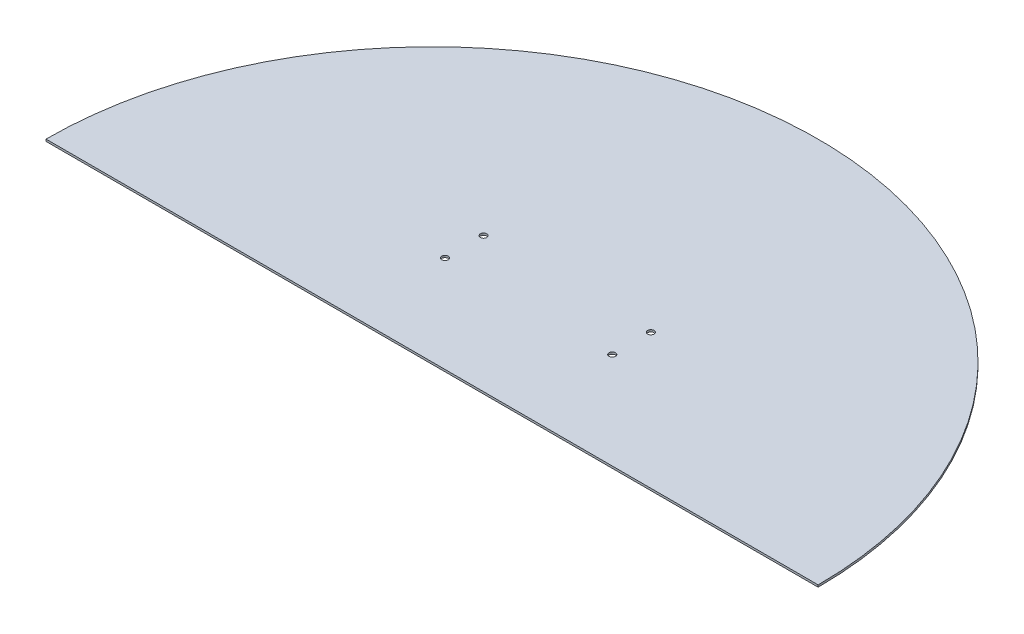
ISO-10303-21;
HEADER;
FILE_DESCRIPTION(('STEP AP214'),'2;1');
FILE_NAME('part.step','',(''),(''),'','','');
FILE_SCHEMA(('AUTOMOTIVE_DESIGN { 1 0 10303 214 1 1 1 1 }'));
ENDSEC;
DATA;
#1=APPLICATION_CONTEXT('core data for automotive mechanical design processes');
#2=APPLICATION_PROTOCOL_DEFINITION('international standard','automotive_design',2000,#1);
#3=PRODUCT_CONTEXT('',#1,'mechanical');
#4=PRODUCT('Part','Part','',(#3));
#5=PRODUCT_RELATED_PRODUCT_CATEGORY('part','',(#4));
#6=PRODUCT_DEFINITION_FORMATION('','',#4);
#7=PRODUCT_DEFINITION_CONTEXT('part definition',#1,'design');
#8=PRODUCT_DEFINITION('design','',#6,#7);
#9=PRODUCT_DEFINITION_SHAPE('','',#8);
#10=(LENGTH_UNIT() NAMED_UNIT(*) SI_UNIT(.MILLI.,.METRE.));
#11=(NAMED_UNIT(*) PLANE_ANGLE_UNIT() SI_UNIT($,.RADIAN.));
#12=(NAMED_UNIT(*) SI_UNIT($,.STERADIAN.) SOLID_ANGLE_UNIT());
#13=UNCERTAINTY_MEASURE_WITH_UNIT(LENGTH_MEASURE(1.E-05),#10,'distance_accuracy_value','');
#14=(GEOMETRIC_REPRESENTATION_CONTEXT(3) GLOBAL_UNCERTAINTY_ASSIGNED_CONTEXT((#13)) GLOBAL_UNIT_ASSIGNED_CONTEXT((#10,
#11,#12)) REPRESENTATION_CONTEXT('',''));
#15=CARTESIAN_POINT('',(0.,0.,0.));
#16=DIRECTION('',(0.,0.,1.));
#17=DIRECTION('',(1.,0.,0.));
#18=AXIS2_PLACEMENT_3D('',#15,#16,#17);
#19=CARTESIAN_POINT('',(0.,3.175,0.));
#20=DIRECTION('',(0.,-1.,0.));
#21=DIRECTION('',(0.,0.,-1.));
#22=AXIS2_PLACEMENT_3D('',#19,#20,#21);
#23=CYLINDRICAL_SURFACE('',#22,600.);
#24=CARTESIAN_POINT('',(0.,0.,0.));
#25=DIRECTION('',(0.,1.,0.));
#26=DIRECTION('',(0.,0.,1.));
#27=AXIS2_PLACEMENT_3D('',#24,#25,#26);
#28=CIRCLE('',#27,600.);
#29=CARTESIAN_POINT('',(600.,0.,0.));
#30=VERTEX_POINT('',#29);
#31=CARTESIAN_POINT('',(-600.,0.,0.));
#32=VERTEX_POINT('',#31);
#33=EDGE_CURVE('E70',#30,#32,#28,.T.);
#34=ORIENTED_EDGE('',*,*,#33,.T.);
#35=DIRECTION('',(0.,-1.,0.));
#36=VECTOR('',#35,1.);
#37=CARTESIAN_POINT('',(-600.,3.175,0.));
#38=LINE('',#37,#36);
#39=CARTESIAN_POINT('',(-600.,3.175,0.));
#40=VERTEX_POINT('',#39);
#41=EDGE_CURVE('E11',#40,#32,#38,.T.);
#42=ORIENTED_EDGE('',*,*,#41,.F.);
#43=CARTESIAN_POINT('',(0.,3.175,0.));
#44=DIRECTION('',(0.,1.,0.));
#45=DIRECTION('',(0.,0.,1.));
#46=AXIS2_PLACEMENT_3D('',#43,#44,#45);
#47=CIRCLE('',#46,600.);
#48=CARTESIAN_POINT('',(600.,3.175,0.));
#49=VERTEX_POINT('',#48);
#50=EDGE_CURVE('E69',#49,#40,#47,.T.);
#51=ORIENTED_EDGE('',*,*,#50,.F.);
#52=DIRECTION('',(0.,-1.,0.));
#53=VECTOR('',#52,1.);
#54=CARTESIAN_POINT('',(600.,3.175,0.));
#55=LINE('',#54,#53);
#56=EDGE_CURVE('E47',#49,#30,#55,.T.);
#57=ORIENTED_EDGE('',*,*,#56,.T.);
#58=EDGE_LOOP('',(#34,#42,#51,#57));
#59=FACE_BOUND('',#58,.T.);
#60=ADVANCED_FACE('F39',(#59),#23,.T.);
#61=CARTESIAN_POINT('',(-600.,3.175,0.));
#62=DIRECTION('',(0.,0.,-1.));
#63=DIRECTION('',(-1.,0.,0.));
#64=AXIS2_PLACEMENT_3D('',#61,#62,#63);
#65=PLANE('',#64);
#66=DIRECTION('',(1.,0.,0.));
#67=VECTOR('',#66,1.);
#68=CARTESIAN_POINT('',(-600.,0.,0.));
#69=LINE('',#68,#67);
#70=EDGE_CURVE('E62',#32,#30,#69,.T.);
#71=ORIENTED_EDGE('',*,*,#70,.T.);
#72=ORIENTED_EDGE('',*,*,#56,.F.);
#73=DIRECTION('',(1.,0.,0.));
#74=VECTOR('',#73,1.);
#75=CARTESIAN_POINT('',(-600.,3.175,0.));
#76=LINE('',#75,#74);
#77=EDGE_CURVE('E54',#40,#49,#76,.T.);
#78=ORIENTED_EDGE('',*,*,#77,.F.);
#79=ORIENTED_EDGE('',*,*,#41,.T.);
#80=EDGE_LOOP('',(#71,#72,#78,#79));
#81=FACE_BOUND('',#80,.T.);
#82=ADVANCED_FACE('F65',(#81),#65,.F.);
#83=CARTESIAN_POINT('',(0.,3.175,0.));
#84=DIRECTION('',(0.,1.,0.));
#85=DIRECTION('',(0.,0.,1.));
#86=AXIS2_PLACEMENT_3D('',#83,#84,#85);
#87=PLANE('',#86);
#88=CARTESIAN_POINT('',(130.,3.175,-210.));
#89=DIRECTION('',(0.,1.,0.));
#90=DIRECTION('',(0.,0.,1.));
#91=AXIS2_PLACEMENT_3D('',#88,#89,#90);
#92=CIRCLE('',#91,5.00000000000002);
#93=CARTESIAN_POINT('',(130.,3.175,-205.));
#94=VERTEX_POINT('',#93);
#95=EDGE_CURVE('E89',#94,#94,#92,.T.);
#96=ORIENTED_EDGE('',*,*,#95,.F.);
#97=EDGE_LOOP('',(#96));
#98=FACE_BOUND('',#97,.T.);
#99=CARTESIAN_POINT('',(130.,3.175,-150.));
#100=DIRECTION('',(0.,1.,0.));
#101=DIRECTION('',(0.,0.,1.));
#102=AXIS2_PLACEMENT_3D('',#99,#100,#101);
#103=CIRCLE('',#102,5.00000000000002);
#104=CARTESIAN_POINT('',(130.,3.175,-145.));
#105=VERTEX_POINT('',#104);
#106=EDGE_CURVE('E88',#105,#105,#103,.T.);
#107=ORIENTED_EDGE('',*,*,#106,.F.);
#108=EDGE_LOOP('',(#107));
#109=FACE_BOUND('',#108,.T.);
#110=CARTESIAN_POINT('',(-130.,3.175,-150.));
#111=DIRECTION('',(0.,1.,0.));
#112=DIRECTION('',(0.,0.,1.));
#113=AXIS2_PLACEMENT_3D('',#110,#111,#112);
#114=CIRCLE('',#113,5.00000000000002);
#115=CARTESIAN_POINT('',(-130.,3.175,-145.));
#116=VERTEX_POINT('',#115);
#117=EDGE_CURVE('E95',#116,#116,#114,.T.);
#118=ORIENTED_EDGE('',*,*,#117,.F.);
#119=EDGE_LOOP('',(#118));
#120=FACE_BOUND('',#119,.T.);
#121=CARTESIAN_POINT('',(-130.,3.175,-210.));
#122=DIRECTION('',(0.,1.,0.));
#123=DIRECTION('',(0.,0.,1.));
#124=AXIS2_PLACEMENT_3D('',#121,#122,#123);
#125=CIRCLE('',#124,5.00000000000002);
#126=CARTESIAN_POINT('',(-130.,3.175,-205.));
#127=VERTEX_POINT('',#126);
#128=EDGE_CURVE('E77',#127,#127,#125,.T.);
#129=ORIENTED_EDGE('',*,*,#128,.F.);
#130=EDGE_LOOP('',(#129));
#131=FACE_BOUND('',#130,.T.);
#132=ORIENTED_EDGE('',*,*,#50,.T.);
#133=ORIENTED_EDGE('',*,*,#77,.T.);
#134=EDGE_LOOP('',(#132,#133));
#135=FACE_BOUND('',#134,.T.);
#136=ADVANCED_FACE('F106',(#98,#109,#120,#131,#135),#87,.T.);
#137=CARTESIAN_POINT('',(0.,0.,0.));
#138=DIRECTION('',(0.,1.,0.));
#139=DIRECTION('',(0.,0.,1.));
#140=AXIS2_PLACEMENT_3D('',#137,#138,#139);
#141=PLANE('',#140);
#142=CARTESIAN_POINT('',(130.,0.,-210.));
#143=DIRECTION('',(0.,1.,0.));
#144=DIRECTION('',(0.,0.,1.));
#145=AXIS2_PLACEMENT_3D('',#142,#143,#144);
#146=CIRCLE('',#145,5.00000000000002);
#147=CARTESIAN_POINT('',(130.,0.,-205.));
#148=VERTEX_POINT('',#147);
#149=EDGE_CURVE('E85',#148,#148,#146,.F.);
#150=ORIENTED_EDGE('',*,*,#149,.F.);
#151=EDGE_LOOP('',(#150));
#152=FACE_BOUND('',#151,.T.);
#153=CARTESIAN_POINT('',(130.,0.,-150.));
#154=DIRECTION('',(0.,1.,0.));
#155=DIRECTION('',(0.,0.,1.));
#156=AXIS2_PLACEMENT_3D('',#153,#154,#155);
#157=CIRCLE('',#156,5.00000000000002);
#158=CARTESIAN_POINT('',(130.,0.,-145.));
#159=VERTEX_POINT('',#158);
#160=EDGE_CURVE('E92',#159,#159,#157,.F.);
#161=ORIENTED_EDGE('',*,*,#160,.F.);
#162=EDGE_LOOP('',(#161));
#163=FACE_BOUND('',#162,.T.);
#164=CARTESIAN_POINT('',(-130.,0.,-150.));
#165=DIRECTION('',(0.,1.,0.));
#166=DIRECTION('',(0.,0.,1.));
#167=AXIS2_PLACEMENT_3D('',#164,#165,#166);
#168=CIRCLE('',#167,5.00000000000002);
#169=CARTESIAN_POINT('',(-130.,0.,-145.));
#170=VERTEX_POINT('',#169);
#171=EDGE_CURVE('E84',#170,#170,#168,.F.);
#172=ORIENTED_EDGE('',*,*,#171,.F.);
#173=EDGE_LOOP('',(#172));
#174=FACE_BOUND('',#173,.T.);
#175=CARTESIAN_POINT('',(-130.,0.,-210.));
#176=DIRECTION('',(0.,1.,0.));
#177=DIRECTION('',(0.,0.,1.));
#178=AXIS2_PLACEMENT_3D('',#175,#176,#177);
#179=CIRCLE('',#178,5.00000000000002);
#180=CARTESIAN_POINT('',(-130.,0.,-205.));
#181=VERTEX_POINT('',#180);
#182=EDGE_CURVE('E74',#181,#181,#179,.F.);
#183=ORIENTED_EDGE('',*,*,#182,.F.);
#184=EDGE_LOOP('',(#183));
#185=FACE_BOUND('',#184,.T.);
#186=ORIENTED_EDGE('',*,*,#33,.F.);
#187=ORIENTED_EDGE('',*,*,#70,.F.);
#188=EDGE_LOOP('',(#186,#187));
#189=FACE_BOUND('',#188,.T.);
#190=ADVANCED_FACE('F73',(#152,#163,#174,#185,#189),#141,.F.);
#191=CARTESIAN_POINT('',(-130.,-0.00100000000000013,-210.));
#192=DIRECTION('',(0.,1.,0.));
#193=DIRECTION('',(0.,0.,1.));
#194=AXIS2_PLACEMENT_3D('',#191,#192,#193);
#195=CYLINDRICAL_SURFACE('',#194,5.00000000000002);
#196=ORIENTED_EDGE('',*,*,#128,.T.);
#197=EDGE_LOOP('',(#196));
#198=FACE_BOUND('',#197,.T.);
#199=ORIENTED_EDGE('',*,*,#182,.T.);
#200=EDGE_LOOP('',(#199));
#201=FACE_BOUND('',#200,.T.);
#202=ADVANCED_FACE('F113',(#198,#201),#195,.F.);
#203=CARTESIAN_POINT('',(-130.,-0.00100000000000013,-150.));
#204=DIRECTION('',(0.,1.,0.));
#205=DIRECTION('',(0.,0.,1.));
#206=AXIS2_PLACEMENT_3D('',#203,#204,#205);
#207=CYLINDRICAL_SURFACE('',#206,5.00000000000002);
#208=ORIENTED_EDGE('',*,*,#117,.T.);
#209=EDGE_LOOP('',(#208));
#210=FACE_BOUND('',#209,.T.);
#211=ORIENTED_EDGE('',*,*,#171,.T.);
#212=EDGE_LOOP('',(#211));
#213=FACE_BOUND('',#212,.T.);
#214=ADVANCED_FACE('F103',(#210,#213),#207,.F.);
#215=CARTESIAN_POINT('',(130.,-0.00100000000000013,-150.));
#216=DIRECTION('',(0.,1.,0.));
#217=DIRECTION('',(0.,0.,1.));
#218=AXIS2_PLACEMENT_3D('',#215,#216,#217);
#219=CYLINDRICAL_SURFACE('',#218,5.00000000000002);
#220=ORIENTED_EDGE('',*,*,#106,.T.);
#221=EDGE_LOOP('',(#220));
#222=FACE_BOUND('',#221,.T.);
#223=ORIENTED_EDGE('',*,*,#160,.T.);
#224=EDGE_LOOP('',(#223));
#225=FACE_BOUND('',#224,.T.);
#226=ADVANCED_FACE('F152',(#222,#225),#219,.F.);
#227=CARTESIAN_POINT('',(130.,-0.00100000000000013,-210.));
#228=DIRECTION('',(0.,1.,0.));
#229=DIRECTION('',(0.,0.,1.));
#230=AXIS2_PLACEMENT_3D('',#227,#228,#229);
#231=CYLINDRICAL_SURFACE('',#230,5.00000000000002);
#232=ORIENTED_EDGE('',*,*,#95,.T.);
#233=EDGE_LOOP('',(#232));
#234=FACE_BOUND('',#233,.T.);
#235=ORIENTED_EDGE('',*,*,#149,.T.);
#236=EDGE_LOOP('',(#235));
#237=FACE_BOUND('',#236,.T.);
#238=ADVANCED_FACE('F159',(#234,#237),#231,.F.);
#239=CLOSED_SHELL('',(#60,#82,#136,#190,#202,#214,#226,#238));
#240=MANIFOLD_SOLID_BREP('B2',#239);
#241=ADVANCED_BREP_SHAPE_REPRESENTATION('',(#18,#240),#14);
#242=SHAPE_DEFINITION_REPRESENTATION(#9,#241);
ENDSEC;
END-ISO-10303-21;
